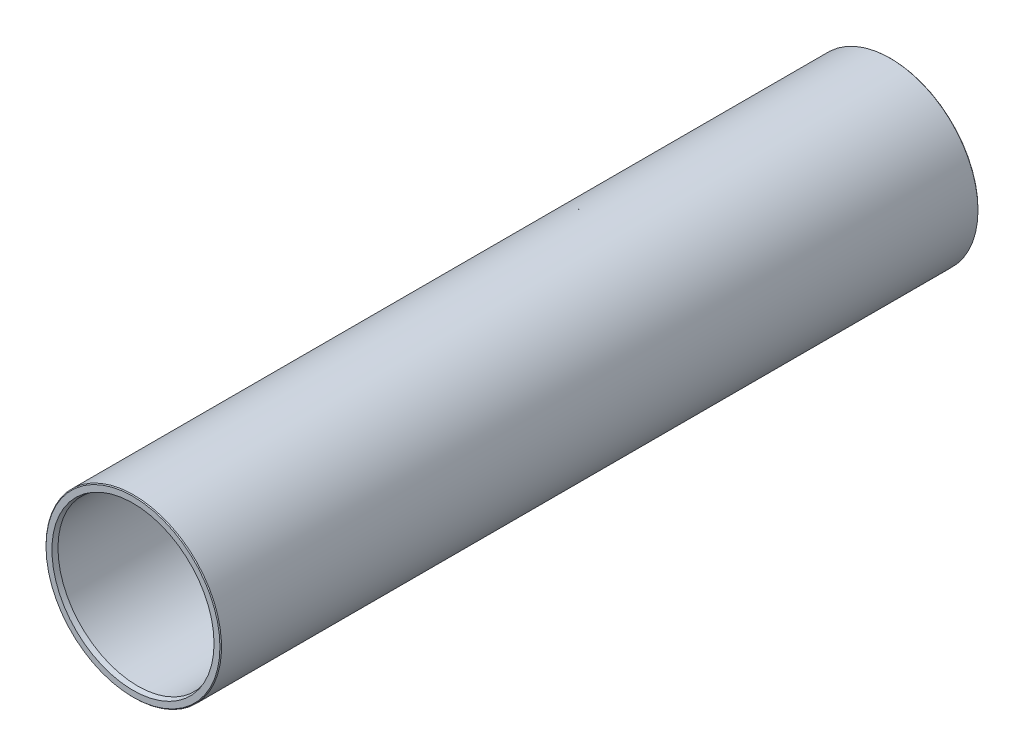
ISO-10303-21;
HEADER;
FILE_DESCRIPTION(('STEP AP214'),'2;1');
FILE_NAME('part.step','',(''),(''),'','','');
FILE_SCHEMA(('AUTOMOTIVE_DESIGN { 1 0 10303 214 1 1 1 1 }'));
ENDSEC;
DATA;
#1=APPLICATION_CONTEXT('core data for automotive mechanical design processes');
#2=APPLICATION_PROTOCOL_DEFINITION('international standard','automotive_design',2000,#1);
#3=PRODUCT_CONTEXT('',#1,'mechanical');
#4=PRODUCT('Part','Part','',(#3));
#5=PRODUCT_RELATED_PRODUCT_CATEGORY('part','',(#4));
#6=PRODUCT_DEFINITION_FORMATION('','',#4);
#7=PRODUCT_DEFINITION_CONTEXT('part definition',#1,'design');
#8=PRODUCT_DEFINITION('design','',#6,#7);
#9=PRODUCT_DEFINITION_SHAPE('','',#8);
#10=(LENGTH_UNIT() NAMED_UNIT(*) SI_UNIT(.MILLI.,.METRE.));
#11=(NAMED_UNIT(*) PLANE_ANGLE_UNIT() SI_UNIT($,.RADIAN.));
#12=(NAMED_UNIT(*) SI_UNIT($,.STERADIAN.) SOLID_ANGLE_UNIT());
#13=UNCERTAINTY_MEASURE_WITH_UNIT(LENGTH_MEASURE(1.E-05),#10,'distance_accuracy_value','');
#14=(GEOMETRIC_REPRESENTATION_CONTEXT(3) GLOBAL_UNCERTAINTY_ASSIGNED_CONTEXT((#13)) GLOBAL_UNIT_ASSIGNED_CONTEXT((#10,
#11,#12)) REPRESENTATION_CONTEXT('',''));
#15=CARTESIAN_POINT('',(0.,0.,0.));
#16=DIRECTION('',(0.,0.,1.));
#17=DIRECTION('',(1.,0.,0.));
#18=AXIS2_PLACEMENT_3D('',#15,#16,#17);
#19=CARTESIAN_POINT('',(0.,0.,237.5));
#20=DIRECTION('',(0.,0.,1.));
#21=DIRECTION('',(1.,0.,0.));
#22=AXIS2_PLACEMENT_3D('',#19,#20,#21);
#23=PLANE('',#22);
#24=CARTESIAN_POINT('',(0.,0.,237.5));
#25=DIRECTION('',(0.,0.,1.));
#26=DIRECTION('',(1.,0.,0.));
#27=AXIS2_PLACEMENT_3D('',#24,#25,#26);
#28=CIRCLE('',#27,54.5000000000001);
#29=CARTESIAN_POINT('',(54.5000000000001,0.,237.5));
#30=VERTEX_POINT('',#29);
#31=EDGE_CURVE('E10',#30,#30,#28,.T.);
#32=ORIENTED_EDGE('',*,*,#31,.T.);
#33=EDGE_LOOP('',(#32));
#34=FACE_BOUND('',#33,.T.);
#35=CARTESIAN_POINT('',(0.,0.,237.5));
#36=DIRECTION('',(0.,0.,1.));
#37=DIRECTION('',(1.,0.,0.));
#38=AXIS2_PLACEMENT_3D('',#35,#36,#37);
#39=CIRCLE('',#38,50.8000000000007);
#40=CARTESIAN_POINT('',(50.8000000000007,0.,237.5));
#41=VERTEX_POINT('',#40);
#42=EDGE_CURVE('E71',#41,#41,#39,.F.);
#43=ORIENTED_EDGE('',*,*,#42,.T.);
#44=EDGE_LOOP('',(#43));
#45=FACE_BOUND('',#44,.T.);
#46=ADVANCED_FACE('F41',(#34,#45),#23,.T.);
#47=CARTESIAN_POINT('',(0.,0.,-237.5));
#48=DIRECTION('',(0.,0.,1.));
#49=DIRECTION('',(1.,0.,0.));
#50=AXIS2_PLACEMENT_3D('',#47,#48,#49);
#51=PLANE('',#50);
#52=CARTESIAN_POINT('',(0.,0.,-237.5));
#53=DIRECTION('',(0.,0.,1.));
#54=DIRECTION('',(1.,0.,0.));
#55=AXIS2_PLACEMENT_3D('',#52,#53,#54);
#56=CIRCLE('',#55,54.4999999999998);
#57=CARTESIAN_POINT('',(54.4999999999998,0.,-237.5));
#58=VERTEX_POINT('',#57);
#59=EDGE_CURVE('E49',#58,#58,#56,.F.);
#60=ORIENTED_EDGE('',*,*,#59,.T.);
#61=EDGE_LOOP('',(#60));
#62=FACE_BOUND('',#61,.T.);
#63=CARTESIAN_POINT('',(0.,0.,-237.5));
#64=DIRECTION('',(0.,0.,1.));
#65=DIRECTION('',(1.,0.,0.));
#66=AXIS2_PLACEMENT_3D('',#63,#64,#65);
#67=CIRCLE('',#66,52.9999999999999);
#68=CARTESIAN_POINT('',(-52.9999999999999,0.,-237.5));
#69=VERTEX_POINT('',#68);
#70=EDGE_CURVE('E68',#69,#69,#67,.T.);
#71=ORIENTED_EDGE('',*,*,#70,.T.);
#72=EDGE_LOOP('',(#71));
#73=FACE_BOUND('',#72,.T.);
#74=ADVANCED_FACE('F99',(#62,#73),#51,.F.);
#75=CARTESIAN_POINT('',(0.,0.,237.5));
#76=DIRECTION('',(0.,0.,-1.));
#77=DIRECTION('',(-1.,0.,0.));
#78=AXIS2_PLACEMENT_3D('',#75,#76,#77);
#79=CYLINDRICAL_SURFACE('',#78,55.);
#80=CARTESIAN_POINT('',(0.,0.,-237.));
#81=DIRECTION('',(0.,0.,1.));
#82=DIRECTION('',(1.,0.,0.));
#83=AXIS2_PLACEMENT_3D('',#80,#81,#82);
#84=CIRCLE('',#83,55.);
#85=CARTESIAN_POINT('',(-55.,0.,-237.));
#86=VERTEX_POINT('',#85);
#87=EDGE_CURVE('E53',#86,#86,#84,.T.);
#88=CARTESIAN_POINT('',(0.,0.,237.));
#89=DIRECTION('',(0.,0.,1.));
#90=DIRECTION('',(1.,0.,0.));
#91=AXIS2_PLACEMENT_3D('',#88,#89,#90);
#92=CIRCLE('',#91,55.);
#93=CARTESIAN_POINT('',(-55.,0.,237.));
#94=VERTEX_POINT('',#93);
#95=EDGE_CURVE('E57',#94,#94,#92,.F.);
#96=CARTESIAN_POINT('',(-55.,0.,-237.));
#97=CARTESIAN_POINT('',(-55.,0.,-232.0625));
#98=CARTESIAN_POINT('',(-55.,0.,-227.125));
#99=CARTESIAN_POINT('',(-55.,0.,-217.25));
#100=CARTESIAN_POINT('',(-55.,0.,-212.3125));
#101=CARTESIAN_POINT('',(-55.,0.,-202.4375));
#102=CARTESIAN_POINT('',(-55.,0.,-197.5));
#103=CARTESIAN_POINT('',(-55.,0.,-187.625));
#104=CARTESIAN_POINT('',(-55.,0.,-182.6875));
#105=CARTESIAN_POINT('',(-55.,0.,-172.8125));
#106=CARTESIAN_POINT('',(-55.,0.,-167.875));
#107=CARTESIAN_POINT('',(-55.,0.,-158.));
#108=CARTESIAN_POINT('',(-55.,0.,-153.0625));
#109=CARTESIAN_POINT('',(-55.,0.,-143.1875));
#110=CARTESIAN_POINT('',(-55.,0.,-138.25));
#111=CARTESIAN_POINT('',(-55.,0.,-128.375));
#112=CARTESIAN_POINT('',(-55.,0.,-123.4375));
#113=CARTESIAN_POINT('',(-55.,0.,-113.5625));
#114=CARTESIAN_POINT('',(-55.,0.,-108.625));
#115=CARTESIAN_POINT('',(-55.,0.,-98.7499999999998));
#116=CARTESIAN_POINT('',(-55.,0.,-93.8124999999998));
#117=CARTESIAN_POINT('',(-55.,0.,-83.9374999999998));
#118=CARTESIAN_POINT('',(-55.,0.,-78.9999999999998));
#119=CARTESIAN_POINT('',(-55.,0.,-69.1249999999998));
#120=CARTESIAN_POINT('',(-55.,0.,-64.1874999999998));
#121=CARTESIAN_POINT('',(-55.,0.,-54.3124999999998));
#122=CARTESIAN_POINT('',(-55.,0.,-49.3749999999998));
#123=CARTESIAN_POINT('',(-55.,0.,-39.4999999999998));
#124=CARTESIAN_POINT('',(-55.,0.,-34.5624999999998));
#125=CARTESIAN_POINT('',(-55.,0.,-24.6874999999998));
#126=CARTESIAN_POINT('',(-55.,0.,-19.7499999999998));
#127=CARTESIAN_POINT('',(-55.,0.,-9.87499999999985));
#128=CARTESIAN_POINT('',(-55.,0.,-4.93749999999985));
#129=CARTESIAN_POINT('',(-55.,0.,4.93750000000014));
#130=CARTESIAN_POINT('',(-55.,0.,9.87500000000014));
#131=CARTESIAN_POINT('',(-55.,0.,19.7500000000001));
#132=CARTESIAN_POINT('',(-55.,0.,24.6875000000001));
#133=CARTESIAN_POINT('',(-55.,0.,34.5625000000001));
#134=CARTESIAN_POINT('',(-55.,0.,39.5000000000001));
#135=CARTESIAN_POINT('',(-55.,0.,49.3750000000001));
#136=CARTESIAN_POINT('',(-55.,0.,54.3125000000001));
#137=CARTESIAN_POINT('',(-55.,0.,64.1875000000001));
#138=CARTESIAN_POINT('',(-55.,0.,69.1250000000001));
#139=CARTESIAN_POINT('',(-55.,0.,79.0000000000001));
#140=CARTESIAN_POINT('',(-55.,0.,83.9375000000001));
#141=CARTESIAN_POINT('',(-55.,0.,93.8125000000001));
#142=CARTESIAN_POINT('',(-55.,0.,98.7500000000001));
#143=CARTESIAN_POINT('',(-55.,0.,108.625));
#144=CARTESIAN_POINT('',(-55.,0.,113.5625));
#145=CARTESIAN_POINT('',(-55.,0.,123.4375));
#146=CARTESIAN_POINT('',(-55.,0.,128.375));
#147=CARTESIAN_POINT('',(-55.,0.,138.25));
#148=CARTESIAN_POINT('',(-55.,0.,143.1875));
#149=CARTESIAN_POINT('',(-55.,0.,153.0625));
#150=CARTESIAN_POINT('',(-55.,0.,158.));
#151=CARTESIAN_POINT('',(-55.,0.,167.875));
#152=CARTESIAN_POINT('',(-55.,0.,172.8125));
#153=CARTESIAN_POINT('',(-55.,0.,182.6875));
#154=CARTESIAN_POINT('',(-55.,0.,187.625));
#155=CARTESIAN_POINT('',(-55.,0.,197.5));
#156=CARTESIAN_POINT('',(-55.,0.,202.4375));
#157=CARTESIAN_POINT('',(-55.,0.,212.3125));
#158=CARTESIAN_POINT('',(-55.,0.,217.25));
#159=CARTESIAN_POINT('',(-55.,0.,227.125));
#160=CARTESIAN_POINT('',(-55.,0.,232.0625));
#161=CARTESIAN_POINT('',(-55.,0.,237.));
#162=B_SPLINE_CURVE_WITH_KNOTS('',3,(#96,#97,#98,#99,#100,#101,#102,#103,#104,#105,#106,#107,
#108,#109,#110,#111,#112,#113,#114,#115,#116,#117,#118,#119,#120,#121,#122,#123,#124,#125,#126,
#127,#128,#129,#130,#131,#132,#133,#134,#135,#136,#137,#138,#139,#140,#141,#142,#143,#144,#145,
#146,#147,#148,#149,#150,#151,#152,#153,#154,#155,#156,#157,#158,#159,#160,#161),.UNSPECIFIED.,
.F.,.F.,(4,2,2,2,2,2,2,2,2,2,2,2,2,2,2,2,2,2,2,2,2,2,2,2,2,2,2,2,2,2,2,2,4),(0.,14.8125,29.625,
44.4375,59.25,74.0625,88.875,103.6875,118.5,133.3125,148.125,162.9375,177.75,192.5625,207.375,
222.1875,237.,251.8125,266.625,281.4375,296.25,311.0625,325.875,340.6875,355.5,370.3125,385.125,
399.9375,414.75,429.5625,444.375,459.1875,474.),.UNSPECIFIED.);
#163=EDGE_CURVE('BSEAM92',#86,#94,#162,.T.);
#164=ORIENTED_EDGE('',*,*,#87,.T.);
#165=ORIENTED_EDGE('',*,*,#95,.T.);
#166=ORIENTED_EDGE('',*,*,#163,.T.);
#167=ORIENTED_EDGE('',*,*,#163,.F.);
#168=EDGE_LOOP('',(#164,#166,#165,#167));
#169=FACE_BOUND('',#168,.T.);
#170=ADVANCED_FACE('F92',(#169),#79,.T.);
#171=CARTESIAN_POINT('',(0.,0.,237.5));
#172=DIRECTION('',(0.,0.,-1.));
#173=DIRECTION('',(-1.,0.,0.));
#174=AXIS2_PLACEMENT_3D('',#171,#172,#173);
#175=CYLINDRICAL_SURFACE('',#174,50.);
#176=CARTESIAN_POINT('',(0.,0.,-233.699999999996));
#177=DIRECTION('',(0.,0.,-1.));
#178=DIRECTION('',(-1.,0.,0.));
#179=AXIS2_PLACEMENT_3D('',#176,#177,#178);
#180=CIRCLE('',#179,50.);
#181=CARTESIAN_POINT('',(-50.,0.,-233.699999999996));
#182=VERTEX_POINT('',#181);
#183=EDGE_CURVE('E65',#182,#182,#180,.T.);
#184=CARTESIAN_POINT('',(0.,0.,234.499999999997));
#185=DIRECTION('',(0.,0.,1.));
#186=DIRECTION('',(1.,0.,0.));
#187=AXIS2_PLACEMENT_3D('',#184,#185,#186);
#188=CIRCLE('',#187,50.);
#189=CARTESIAN_POINT('',(-50.,0.,234.499999999997));
#190=VERTEX_POINT('',#189);
#191=EDGE_CURVE('E74',#190,#190,#188,.T.);
#192=CARTESIAN_POINT('',(-50.,0.,-233.699999999996));
#193=CARTESIAN_POINT('',(-50.,0.,-228.822916666663));
#194=CARTESIAN_POINT('',(-50.,0.,-223.94583333333));
#195=CARTESIAN_POINT('',(-50.,0.,-214.191666666663));
#196=CARTESIAN_POINT('',(-50.,0.,-209.31458333333));
#197=CARTESIAN_POINT('',(-50.,0.,-199.560416666663));
#198=CARTESIAN_POINT('',(-50.,0.,-194.68333333333));
#199=CARTESIAN_POINT('',(-50.,0.,-184.929166666663));
#200=CARTESIAN_POINT('',(-50.,0.,-180.05208333333));
#201=CARTESIAN_POINT('',(-50.,0.,-170.297916666664));
#202=CARTESIAN_POINT('',(-50.,0.,-165.42083333333));
#203=CARTESIAN_POINT('',(-50.,0.,-155.666666666664));
#204=CARTESIAN_POINT('',(-50.,0.,-150.789583333331));
#205=CARTESIAN_POINT('',(-50.,0.,-141.035416666664));
#206=CARTESIAN_POINT('',(-50.,0.,-136.158333333331));
#207=CARTESIAN_POINT('',(-50.,0.,-126.404166666664));
#208=CARTESIAN_POINT('',(-50.,0.,-121.527083333331));
#209=CARTESIAN_POINT('',(-50.,0.,-111.772916666664));
#210=CARTESIAN_POINT('',(-50.,0.,-106.895833333331));
#211=CARTESIAN_POINT('',(-50.,0.,-97.1416666666647));
#212=CARTESIAN_POINT('',(-50.,0.,-92.2645833333314));
#213=CARTESIAN_POINT('',(-50.,0.,-82.5104166666649));
#214=CARTESIAN_POINT('',(-50.,0.,-77.6333333333316));
#215=CARTESIAN_POINT('',(-50.,0.,-67.879166666665));
#216=CARTESIAN_POINT('',(-50.,0.,-63.0020833333318));
#217=CARTESIAN_POINT('',(-50.,0.,-53.2479166666653));
#218=CARTESIAN_POINT('',(-50.,0.,-48.370833333332));
#219=CARTESIAN_POINT('',(-50.,0.,-38.6166666666654));
#220=CARTESIAN_POINT('',(-50.,0.,-33.7395833333322));
#221=CARTESIAN_POINT('',(-50.,0.,-23.9854166666656));
#222=CARTESIAN_POINT('',(-50.,0.,-19.1083333333324));
#223=CARTESIAN_POINT('',(-50.,0.,-9.35416666666588));
#224=CARTESIAN_POINT('',(-50.,0.,-4.47708333333261));
#225=CARTESIAN_POINT('',(-50.,0.,5.27708333333391));
#226=CARTESIAN_POINT('',(-50.,0.,10.1541666666672));
#227=CARTESIAN_POINT('',(-50.,0.,19.9083333333337));
#228=CARTESIAN_POINT('',(-50.,0.,24.785416666667));
#229=CARTESIAN_POINT('',(-50.,0.,34.5395833333335));
#230=CARTESIAN_POINT('',(-50.,0.,39.4166666666668));
#231=CARTESIAN_POINT('',(-50.,0.,49.1708333333333));
#232=CARTESIAN_POINT('',(-50.,0.,54.0479166666666));
#233=CARTESIAN_POINT('',(-50.,0.,63.8020833333331));
#234=CARTESIAN_POINT('',(-50.,0.,68.6791666666664));
#235=CARTESIAN_POINT('',(-50.,0.,78.4333333333329));
#236=CARTESIAN_POINT('',(-50.,0.,83.3104166666662));
#237=CARTESIAN_POINT('',(-50.,0.,93.0645833333327));
#238=CARTESIAN_POINT('',(-50.,0.,97.941666666666));
#239=CARTESIAN_POINT('',(-50.,0.,107.695833333333));
#240=CARTESIAN_POINT('',(-50.,0.,112.572916666666));
#241=CARTESIAN_POINT('',(-50.,0.,122.327083333332));
#242=CARTESIAN_POINT('',(-50.,0.,127.204166666666));
#243=CARTESIAN_POINT('',(-50.,0.,136.958333333332));
#244=CARTESIAN_POINT('',(-50.,0.,141.835416666665));
#245=CARTESIAN_POINT('',(-50.,0.,151.589583333332));
#246=CARTESIAN_POINT('',(-50.,0.,156.466666666665));
#247=CARTESIAN_POINT('',(-50.,0.,166.220833333332));
#248=CARTESIAN_POINT('',(-50.,0.,171.097916666665));
#249=CARTESIAN_POINT('',(-50.,0.,180.852083333332));
#250=CARTESIAN_POINT('',(-50.,0.,185.729166666665));
#251=CARTESIAN_POINT('',(-50.,0.,195.483333333331));
#252=CARTESIAN_POINT('',(-50.,0.,200.360416666665));
#253=CARTESIAN_POINT('',(-50.,0.,210.114583333331));
#254=CARTESIAN_POINT('',(-50.,0.,214.991666666664));
#255=CARTESIAN_POINT('',(-50.,0.,224.745833333331));
#256=CARTESIAN_POINT('',(-50.,0.,229.622916666664));
#257=CARTESIAN_POINT('',(-50.,0.,234.499999999997));
#258=B_SPLINE_CURVE_WITH_KNOTS('',3,(#192,#193,#194,#195,#196,#197,#198,#199,#200,#201,#202,
#203,#204,#205,#206,#207,#208,#209,#210,#211,#212,#213,#214,#215,#216,#217,#218,#219,#220,#221,
#222,#223,#224,#225,#226,#227,#228,#229,#230,#231,#232,#233,#234,#235,#236,#237,#238,#239,#240,
#241,#242,#243,#244,#245,#246,#247,#248,#249,#250,#251,#252,#253,#254,#255,#256,#257),
.UNSPECIFIED.,.F.,.F.,(4,2,2,2,2,2,2,2,2,2,2,2,2,2,2,2,2,2,2,2,2,2,2,2,2,2,2,2,2,2,2,2,4),(0.,
14.6312499999998,29.2624999999996,43.8937499999994,58.5249999999992,73.156249999999,
87.7874999999988,102.418749999999,117.049999999998,131.681249999998,146.312499999998,
160.943749999998,175.574999999998,190.206249999997,204.837499999997,219.468749999997,
234.099999999997,248.731249999997,263.362499999996,277.993749999996,292.624999999996,
307.256249999996,321.887499999996,336.518749999995,351.149999999995,365.781249999995,
380.412499999995,395.043749999995,409.674999999994,424.306249999994,438.937499999994,
453.568749999994,468.199999999994),.UNSPECIFIED.);
#259=EDGE_CURVE('BSEAM78',#182,#190,#258,.T.);
#260=ORIENTED_EDGE('',*,*,#183,.T.);
#261=ORIENTED_EDGE('',*,*,#191,.T.);
#262=ORIENTED_EDGE('',*,*,#259,.T.);
#263=ORIENTED_EDGE('',*,*,#259,.F.);
#264=EDGE_LOOP('',(#260,#262,#261,#263));
#265=FACE_BOUND('',#264,.T.);
#266=ADVANCED_FACE('F78',(#265),#175,.F.);
#267=CARTESIAN_POINT('',(0.,0.,234.499999999997));
#268=DIRECTION('',(0.,0.,1.));
#269=DIRECTION('',(1.,0.,0.));
#270=AXIS2_PLACEMENT_3D('',#267,#268,#269);
#271=CONICAL_SURFACE('',#270,50.,0.260602391747337);
#272=ORIENTED_EDGE('',*,*,#42,.F.);
#273=EDGE_LOOP('',(#272));
#274=FACE_BOUND('',#273,.T.);
#275=ORIENTED_EDGE('',*,*,#191,.F.);
#276=EDGE_LOOP('',(#275));
#277=FACE_BOUND('',#276,.T.);
#278=ADVANCED_FACE('F80',(#274,#277),#271,.F.);
#279=CARTESIAN_POINT('',(0.,0.,-237.5));
#280=DIRECTION('',(0.,0.,-1.));
#281=DIRECTION('',(-1.,0.,0.));
#282=AXIS2_PLACEMENT_3D('',#279,#280,#281);
#283=CONICAL_SURFACE('',#282,52.9999999999999,1.31019393504757);
#284=CARTESIAN_POINT('',(0.,0.,-236.906130120449));
#285=DIRECTION('',(0.,0.,1.));
#286=DIRECTION('',(1.,0.,0.));
#287=AXIS2_PLACEMENT_3D('',#284,#285,#286);
#288=CIRCLE('',#287,50.772987951682);
#289=CARTESIAN_POINT('',(-50.772987951682,0.,-236.906130120449));
#290=VERTEX_POINT('',#289);
#291=EDGE_CURVE('E62',#290,#290,#288,.T.);
#292=CARTESIAN_POINT('',(-50.772987951682,0.,-236.906130120449));
#293=CARTESIAN_POINT('',(-50.796185993852,0.,-236.912316265027));
#294=CARTESIAN_POINT('',(-50.819384036022,0.,-236.918502409606));
#295=CARTESIAN_POINT('',(-50.8657801203619,0.,-236.930874698763));
#296=CARTESIAN_POINT('',(-50.8889781625319,0.,-236.937060843342));
#297=CARTESIAN_POINT('',(-50.9353742468719,0.,-236.949433132499));
#298=CARTESIAN_POINT('',(-50.9585722890418,0.,-236.955619277078));
#299=CARTESIAN_POINT('',(-51.0049683733818,0.,-236.967991566235));
#300=CARTESIAN_POINT('',(-51.0281664155518,0.,-236.974177710814));
#301=CARTESIAN_POINT('',(-51.0745624998917,0.,-236.986549999971));
#302=CARTESIAN_POINT('',(-51.0977605420617,0.,-236.99273614455));
#303=CARTESIAN_POINT('',(-51.1441566264017,0.,-237.005108433707));
#304=CARTESIAN_POINT('',(-51.1673546685717,0.,-237.011294578286));
#305=CARTESIAN_POINT('',(-51.2137507529116,0.,-237.023666867443));
#306=CARTESIAN_POINT('',(-51.2369487950816,0.,-237.029853012022));
#307=CARTESIAN_POINT('',(-51.2833448794215,0.,-237.042225301179));
#308=CARTESIAN_POINT('',(-51.3065429215915,0.,-237.048411445758));
#309=CARTESIAN_POINT('',(-51.3529390059315,0.,-237.060783734915));
#310=CARTESIAN_POINT('',(-51.3761370481015,0.,-237.066969879494));
#311=CARTESIAN_POINT('',(-51.4225331324414,0.,-237.079342168651));
#312=CARTESIAN_POINT('',(-51.4457311746114,0.,-237.08552831323));
#313=CARTESIAN_POINT('',(-51.4921272589513,0.,-237.097900602387));
#314=CARTESIAN_POINT('',(-51.5153253011213,0.,-237.104086746966));
#315=CARTESIAN_POINT('',(-51.5617213854613,0.,-237.116459036123));
#316=CARTESIAN_POINT('',(-51.5849194276313,0.,-237.122645180702));
#317=CARTESIAN_POINT('',(-51.6313155119712,0.,-237.135017469859));
#318=CARTESIAN_POINT('',(-51.6545135541412,0.,-237.141203614438));
#319=CARTESIAN_POINT('',(-51.7009096384811,0.,-237.153575903595));
#320=CARTESIAN_POINT('',(-51.7241076806511,0.,-237.159762048174));
#321=CARTESIAN_POINT('',(-51.7705037649911,0.,-237.172134337331));
#322=CARTESIAN_POINT('',(-51.7937018071611,0.,-237.17832048191));
#323=CARTESIAN_POINT('',(-51.840097891501,0.,-237.190692771067));
#324=CARTESIAN_POINT('',(-51.863295933671,0.,-237.196878915646));
#325=CARTESIAN_POINT('',(-51.909692018011,0.,-237.209251204803));
#326=CARTESIAN_POINT('',(-51.9328900601809,0.,-237.215437349382));
#327=CARTESIAN_POINT('',(-51.9792861445209,0.,-237.227809638539));
#328=CARTESIAN_POINT('',(-52.0024841866909,0.,-237.233995783118));
#329=CARTESIAN_POINT('',(-52.0488802710308,0.,-237.246368072275));
#330=CARTESIAN_POINT('',(-52.0720783132008,0.,-237.252554216854));
#331=CARTESIAN_POINT('',(-52.1184743975408,0.,-237.264926506011));
#332=CARTESIAN_POINT('',(-52.1416724397107,0.,-237.27111265059));
#333=CARTESIAN_POINT('',(-52.1880685240507,0.,-237.283484939747));
#334=CARTESIAN_POINT('',(-52.2112665662207,0.,-237.289671084326));
#335=CARTESIAN_POINT('',(-52.2576626505606,0.,-237.302043373483));
#336=CARTESIAN_POINT('',(-52.2808606927306,0.,-237.308229518062));
#337=CARTESIAN_POINT('',(-52.3272567770706,0.,-237.320601807219));
#338=CARTESIAN_POINT('',(-52.3504548192405,0.,-237.326787951798));
#339=CARTESIAN_POINT('',(-52.3968509035805,0.,-237.339160240955));
#340=CARTESIAN_POINT('',(-52.4200489457505,0.,-237.345346385533));
#341=CARTESIAN_POINT('',(-52.4664450300904,0.,-237.357718674691));
#342=CARTESIAN_POINT('',(-52.4896430722604,0.,-237.363904819269));
#343=CARTESIAN_POINT('',(-52.5360391566004,0.,-237.376277108427));
#344=CARTESIAN_POINT('',(-52.5592371987703,0.,-237.382463253005));
#345=CARTESIAN_POINT('',(-52.6056332831103,0.,-237.394835542163));
#346=CARTESIAN_POINT('',(-52.6288313252803,0.,-237.401021686741));
#347=CARTESIAN_POINT('',(-52.6752274096202,0.,-237.413393975899));
#348=CARTESIAN_POINT('',(-52.6984254517902,0.,-237.419580120477));
#349=CARTESIAN_POINT('',(-52.7448215361302,0.,-237.431952409635));
#350=CARTESIAN_POINT('',(-52.7680195783001,0.,-237.438138554213));
#351=CARTESIAN_POINT('',(-52.8144156626401,0.,-237.450510843371));
#352=CARTESIAN_POINT('',(-52.8376137048101,0.,-237.456696987949));
#353=CARTESIAN_POINT('',(-52.88400978915,0.,-237.469069277107));
#354=CARTESIAN_POINT('',(-52.90720783132,0.,-237.475255421685));
#355=CARTESIAN_POINT('',(-52.95360391566,0.,-237.487627710843));
#356=CARTESIAN_POINT('',(-52.9768019578299,0.,-237.493813855421));
#357=CARTESIAN_POINT('',(-52.9999999999999,0.,-237.5));
#358=B_SPLINE_CURVE_WITH_KNOTS('',3,(#292,#293,#294,#295,#296,#297,#298,#299,#300,#301,#302,
#303,#304,#305,#306,#307,#308,#309,#310,#311,#312,#313,#314,#315,#316,#317,#318,#319,#320,#321,
#322,#323,#324,#325,#326,#327,#328,#329,#330,#331,#332,#333,#334,#335,#336,#337,#338,#339,#340,
#341,#342,#343,#344,#345,#346,#347,#348,#349,#350,#351,#352,#353,#354,#355,#356,#357),
.UNSPECIFIED.,.F.,.F.,(4,2,2,2,2,2,2,2,2,2,2,2,2,2,2,2,2,2,2,2,2,2,2,2,2,2,2,2,2,2,2,2,4),(0.,
0.0720260918515845,0.144052183703176,0.216078275554761,0.288104367406352,0.360130459257943,
0.432156551109535,0.504182642961119,0.576208734812711,0.648234826664303,0.720260918515887,
0.792287010367479,0.864313102219063,0.936339194070655,1.00836528592225,1.08039137777384,
1.15241746962543,1.22444356147701,1.29646965332861,1.36849574518019,1.44052183703178,
1.51254792888337,1.58457402073496,1.65660011258655,1.72862620443814,1.80065229628973,
1.87267838814132,1.94470447999291,2.01673057184449,2.08875666369608,2.16078275554767,
2.23280884739926,2.30483493925085),.UNSPECIFIED.);
#359=EDGE_CURVE('BSEAM82',#290,#69,#358,.T.);
#360=ORIENTED_EDGE('',*,*,#291,.T.);
#361=ORIENTED_EDGE('',*,*,#70,.F.);
#362=ORIENTED_EDGE('',*,*,#359,.T.);
#363=ORIENTED_EDGE('',*,*,#359,.F.);
#364=EDGE_LOOP('',(#360,#362,#361,#363));
#365=FACE_BOUND('',#364,.T.);
#366=ADVANCED_FACE('F82',(#365),#283,.F.);
#367=CARTESIAN_POINT('',(0.,0.,-233.699999999996));
#368=DIRECTION('',(0.,0.,-1.));
#369=DIRECTION('',(-1.,0.,0.));
#370=AXIS2_PLACEMENT_3D('',#367,#368,#369);
#371=CONICAL_SURFACE('',#370,50.,0.236581857871056);
#372=ORIENTED_EDGE('',*,*,#291,.F.);
#373=EDGE_LOOP('',(#372));
#374=FACE_BOUND('',#373,.T.);
#375=ORIENTED_EDGE('',*,*,#183,.F.);
#376=EDGE_LOOP('',(#375));
#377=FACE_BOUND('',#376,.T.);
#378=ADVANCED_FACE('F89',(#374,#377),#371,.F.);
#379=CARTESIAN_POINT('',(0.,0.,-237.));
#380=DIRECTION('',(0.,0.,1.));
#381=DIRECTION('',(1.,0.,0.));
#382=AXIS2_PLACEMENT_3D('',#379,#380,#381);
#383=CONICAL_SURFACE('',#382,55.,0.785398163397407);
#384=ORIENTED_EDGE('',*,*,#59,.F.);
#385=EDGE_LOOP('',(#384));
#386=FACE_BOUND('',#385,.T.);
#387=ORIENTED_EDGE('',*,*,#87,.F.);
#388=EDGE_LOOP('',(#387));
#389=FACE_BOUND('',#388,.T.);
#390=ADVANCED_FACE('F118',(#386,#389),#383,.T.);
#391=CARTESIAN_POINT('',(0.,0.,237.5));
#392=DIRECTION('',(0.,0.,-1.));
#393=DIRECTION('',(-1.,0.,0.));
#394=AXIS2_PLACEMENT_3D('',#391,#392,#393);
#395=CONICAL_SURFACE('',#394,54.5000000000001,0.785398163397414);
#396=ORIENTED_EDGE('',*,*,#95,.F.);
#397=EDGE_LOOP('',(#396));
#398=FACE_BOUND('',#397,.T.);
#399=ORIENTED_EDGE('',*,*,#31,.F.);
#400=EDGE_LOOP('',(#399));
#401=FACE_BOUND('',#400,.T.);
#402=ADVANCED_FACE('F44',(#398,#401),#395,.T.);
#403=CLOSED_SHELL('',(#46,#74,#170,#266,#278,#366,#378,#390,#402));
#404=MANIFOLD_SOLID_BREP('B2',#403);
#405=ADVANCED_BREP_SHAPE_REPRESENTATION('',(#18,#404),#14);
#406=SHAPE_DEFINITION_REPRESENTATION(#9,#405);
ENDSEC;
END-ISO-10303-21;
